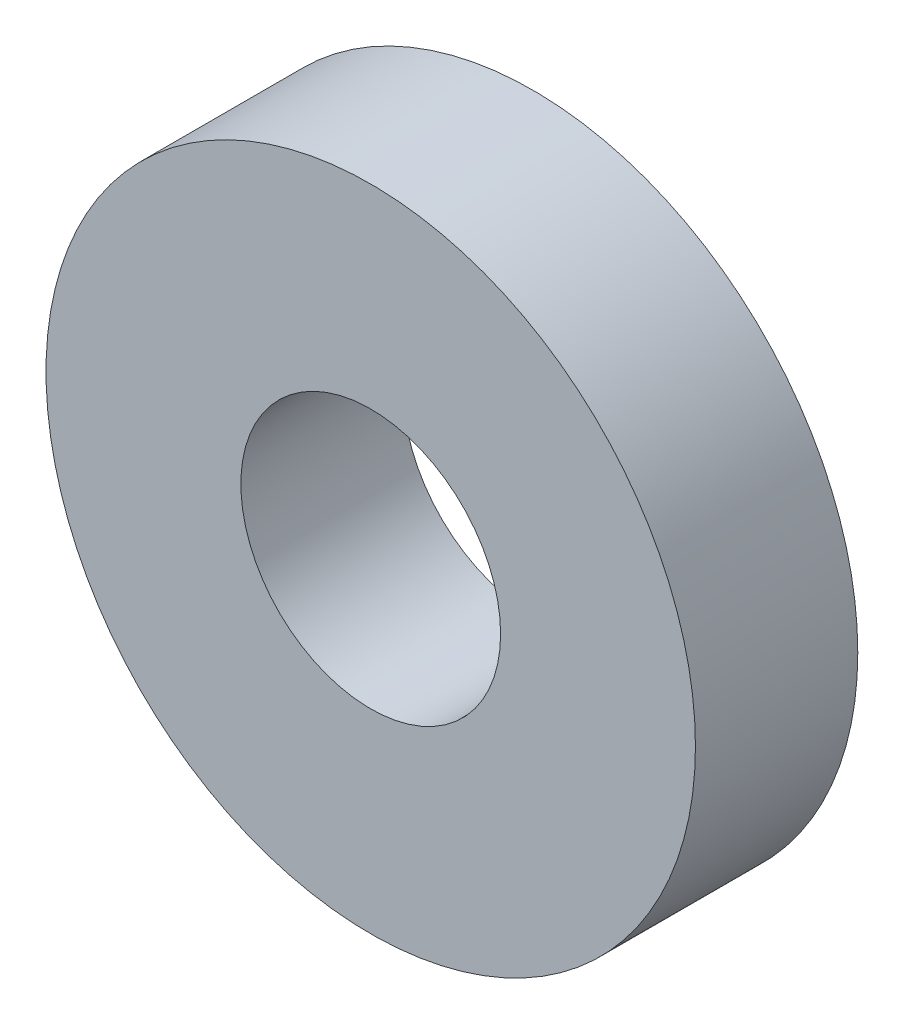
ISO-10303-21;
HEADER;
FILE_DESCRIPTION(('STEP AP214'),'2;1');
FILE_NAME('part.step','',(''),(''),'','','');
FILE_SCHEMA(('AUTOMOTIVE_DESIGN { 1 0 10303 214 1 1 1 1 }'));
ENDSEC;
DATA;
#1=APPLICATION_CONTEXT('core data for automotive mechanical design processes');
#2=APPLICATION_PROTOCOL_DEFINITION('international standard','automotive_design',2000,#1);
#3=PRODUCT_CONTEXT('',#1,'mechanical');
#4=PRODUCT('Part','Part','',(#3));
#5=PRODUCT_RELATED_PRODUCT_CATEGORY('part','',(#4));
#6=PRODUCT_DEFINITION_FORMATION('','',#4);
#7=PRODUCT_DEFINITION_CONTEXT('part definition',#1,'design');
#8=PRODUCT_DEFINITION('design','',#6,#7);
#9=PRODUCT_DEFINITION_SHAPE('','',#8);
#10=(LENGTH_UNIT() NAMED_UNIT(*) SI_UNIT(.MILLI.,.METRE.));
#11=(NAMED_UNIT(*) PLANE_ANGLE_UNIT() SI_UNIT($,.RADIAN.));
#12=(NAMED_UNIT(*) SI_UNIT($,.STERADIAN.) SOLID_ANGLE_UNIT());
#13=UNCERTAINTY_MEASURE_WITH_UNIT(LENGTH_MEASURE(1.E-05),#10,'distance_accuracy_value','');
#14=(GEOMETRIC_REPRESENTATION_CONTEXT(3) GLOBAL_UNCERTAINTY_ASSIGNED_CONTEXT((#13)) GLOBAL_UNIT_ASSIGNED_CONTEXT((#10,
#11,#12)) REPRESENTATION_CONTEXT('',''));
#15=CARTESIAN_POINT('',(0.,0.,0.));
#16=DIRECTION('',(0.,0.,1.));
#17=DIRECTION('',(1.,0.,0.));
#18=AXIS2_PLACEMENT_3D('',#15,#16,#17);
#19=CARTESIAN_POINT('',(0.,0.,0.999999999999999));
#20=DIRECTION('',(0.,0.,1.));
#21=DIRECTION('',(1.,0.,0.));
#22=AXIS2_PLACEMENT_3D('',#19,#20,#21);
#23=PLANE('',#22);
#24=CARTESIAN_POINT('',(0.,0.,0.999999999999999));
#25=DIRECTION('',(0.,0.,1.));
#26=DIRECTION('',(1.,0.,0.));
#27=AXIS2_PLACEMENT_3D('',#24,#25,#26);
#28=CIRCLE('',#27,4.);
#29=CARTESIAN_POINT('',(4.,0.,0.999999999999999));
#30=VERTEX_POINT('',#29);
#31=EDGE_CURVE('E10',#30,#30,#28,.T.);
#32=ORIENTED_EDGE('',*,*,#31,.T.);
#33=EDGE_LOOP('',(#32));
#34=FACE_BOUND('',#33,.T.);
#35=CARTESIAN_POINT('',(0.,0.,0.999999999999999));
#36=DIRECTION('',(0.,0.,1.));
#37=DIRECTION('',(1.,0.,0.));
#38=AXIS2_PLACEMENT_3D('',#35,#36,#37);
#39=CIRCLE('',#38,1.6);
#40=CARTESIAN_POINT('',(1.6,0.,0.999999999999999));
#41=VERTEX_POINT('',#40);
#42=EDGE_CURVE('E35',#41,#41,#39,.T.);
#43=ORIENTED_EDGE('',*,*,#42,.F.);
#44=EDGE_LOOP('',(#43));
#45=FACE_BOUND('',#44,.T.);
#46=ADVANCED_FACE('F28',(#34,#45),#23,.T.);
#47=CARTESIAN_POINT('',(0.,0.,0.999999999999999));
#48=DIRECTION('',(0.,0.,-1.));
#49=DIRECTION('',(-1.,0.,0.));
#50=AXIS2_PLACEMENT_3D('',#47,#48,#49);
#51=CYLINDRICAL_SURFACE('',#50,4.);
#52=ORIENTED_EDGE('',*,*,#31,.F.);
#53=EDGE_LOOP('',(#52));
#54=FACE_BOUND('',#53,.T.);
#55=CARTESIAN_POINT('',(0.,0.,-0.999999999999999));
#56=DIRECTION('',(0.,0.,1.));
#57=DIRECTION('',(1.,0.,0.));
#58=AXIS2_PLACEMENT_3D('',#55,#56,#57);
#59=CIRCLE('',#58,4.);
#60=CARTESIAN_POINT('',(4.,0.,-0.999999999999999));
#61=VERTEX_POINT('',#60);
#62=EDGE_CURVE('E39',#61,#61,#59,.T.);
#63=ORIENTED_EDGE('',*,*,#62,.T.);
#64=EDGE_LOOP('',(#63));
#65=FACE_BOUND('',#64,.T.);
#66=ADVANCED_FACE('F30',(#54,#65),#51,.T.);
#67=CARTESIAN_POINT('',(0.,0.,0.999999999999999));
#68=DIRECTION('',(0.,0.,-1.));
#69=DIRECTION('',(-1.,0.,0.));
#70=AXIS2_PLACEMENT_3D('',#67,#68,#69);
#71=CYLINDRICAL_SURFACE('',#70,1.6);
#72=ORIENTED_EDGE('',*,*,#42,.T.);
#73=EDGE_LOOP('',(#72));
#74=FACE_BOUND('',#73,.T.);
#75=CARTESIAN_POINT('',(0.,0.,-0.999999999999999));
#76=DIRECTION('',(0.,0.,1.));
#77=DIRECTION('',(1.,0.,0.));
#78=AXIS2_PLACEMENT_3D('',#75,#76,#77);
#79=CIRCLE('',#78,1.6);
#80=CARTESIAN_POINT('',(1.6,0.,-0.999999999999999));
#81=VERTEX_POINT('',#80);
#82=EDGE_CURVE('E43',#81,#81,#79,.T.);
#83=ORIENTED_EDGE('',*,*,#82,.F.);
#84=EDGE_LOOP('',(#83));
#85=FACE_BOUND('',#84,.T.);
#86=ADVANCED_FACE('F52',(#74,#85),#71,.F.);
#87=CARTESIAN_POINT('',(0.,0.,-0.999999999999999));
#88=DIRECTION('',(0.,0.,1.));
#89=DIRECTION('',(1.,0.,0.));
#90=AXIS2_PLACEMENT_3D('',#87,#88,#89);
#91=PLANE('',#90);
#92=ORIENTED_EDGE('',*,*,#82,.T.);
#93=EDGE_LOOP('',(#92));
#94=FACE_BOUND('',#93,.T.);
#95=ORIENTED_EDGE('',*,*,#62,.F.);
#96=EDGE_LOOP('',(#95));
#97=FACE_BOUND('',#96,.T.);
#98=ADVANCED_FACE('F49',(#94,#97),#91,.F.);
#99=CLOSED_SHELL('',(#46,#66,#86,#98));
#100=MANIFOLD_SOLID_BREP('B2',#99);
#101=ADVANCED_BREP_SHAPE_REPRESENTATION('',(#18,#100),#14);
#102=SHAPE_DEFINITION_REPRESENTATION(#9,#101);
ENDSEC;
END-ISO-10303-21;
